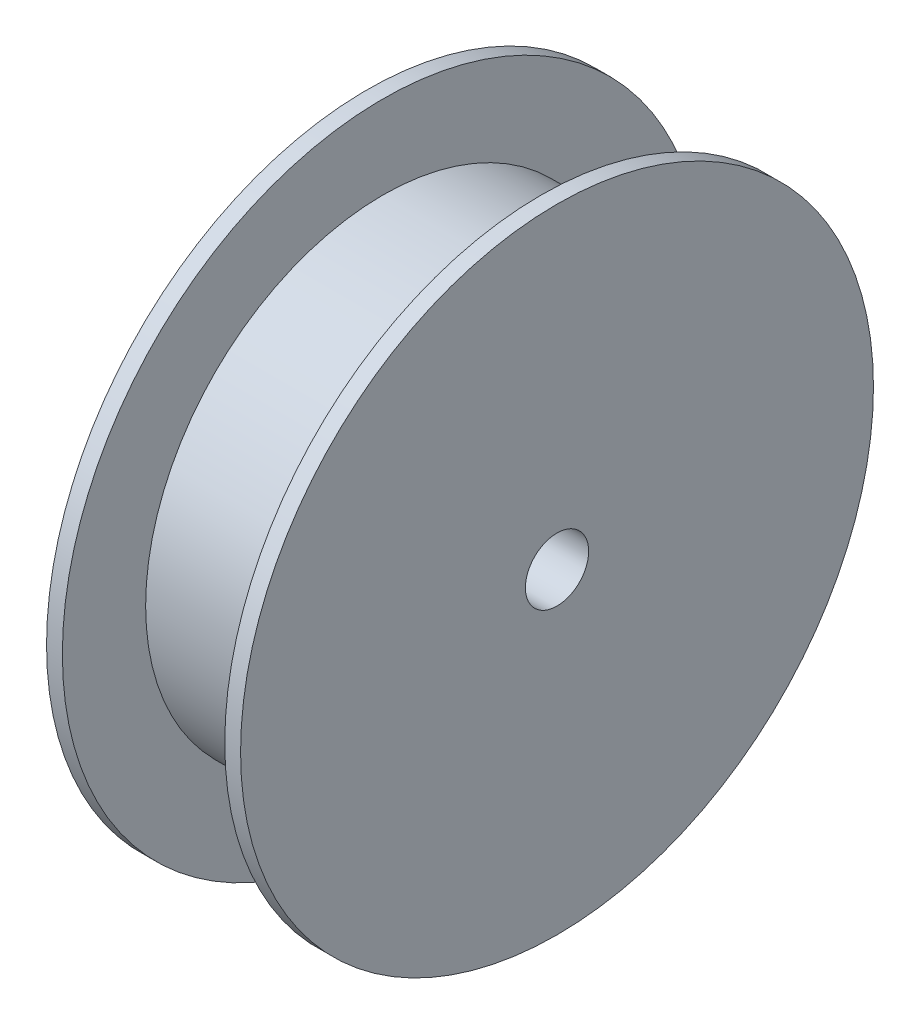
ISO-10303-21;
HEADER;
FILE_DESCRIPTION(('STEP AP214'),'2;1');
FILE_NAME('part.step','',(''),(''),'','','');
FILE_SCHEMA(('AUTOMOTIVE_DESIGN { 1 0 10303 214 1 1 1 1 }'));
ENDSEC;
DATA;
#1=APPLICATION_CONTEXT('core data for automotive mechanical design processes');
#2=APPLICATION_PROTOCOL_DEFINITION('international standard','automotive_design',2000,#1);
#3=PRODUCT_CONTEXT('',#1,'mechanical');
#4=PRODUCT('Part','Part','',(#3));
#5=PRODUCT_RELATED_PRODUCT_CATEGORY('part','',(#4));
#6=PRODUCT_DEFINITION_FORMATION('','',#4);
#7=PRODUCT_DEFINITION_CONTEXT('part definition',#1,'design');
#8=PRODUCT_DEFINITION('design','',#6,#7);
#9=PRODUCT_DEFINITION_SHAPE('','',#8);
#10=(LENGTH_UNIT() NAMED_UNIT(*) SI_UNIT(.MILLI.,.METRE.));
#11=(NAMED_UNIT(*) PLANE_ANGLE_UNIT() SI_UNIT($,.RADIAN.));
#12=(NAMED_UNIT(*) SI_UNIT($,.STERADIAN.) SOLID_ANGLE_UNIT());
#13=UNCERTAINTY_MEASURE_WITH_UNIT(LENGTH_MEASURE(1.E-05),#10,'distance_accuracy_value','');
#14=(GEOMETRIC_REPRESENTATION_CONTEXT(3) GLOBAL_UNCERTAINTY_ASSIGNED_CONTEXT((#13)) GLOBAL_UNIT_ASSIGNED_CONTEXT((#10,
#11,#12)) REPRESENTATION_CONTEXT('',''));
#15=CARTESIAN_POINT('',(0.,0.,0.));
#16=DIRECTION('',(0.,0.,1.));
#17=DIRECTION('',(1.,0.,0.));
#18=AXIS2_PLACEMENT_3D('',#15,#16,#17);
#19=CARTESIAN_POINT('',(-6.5,20.2631578947368,0.));
#20=DIRECTION('',(1.,0.,0.));
#21=DIRECTION('',(0.,0.,-1.));
#22=AXIS2_PLACEMENT_3D('',#19,#20,#21);
#23=PLANE('',#22);
#24=CARTESIAN_POINT('',(-6.5,0.,0.));
#25=DIRECTION('',(1.,0.,0.));
#26=DIRECTION('',(0.,0.,-1.));
#27=AXIS2_PLACEMENT_3D('',#24,#25,#26);
#28=CIRCLE('',#27,2.);
#29=CARTESIAN_POINT('',(-6.5,0.,-2.));
#30=VERTEX_POINT('',#29);
#31=EDGE_CURVE('E56',#30,#30,#28,.T.);
#32=ORIENTED_EDGE('',*,*,#31,.T.);
#33=EDGE_LOOP('',(#32));
#34=FACE_BOUND('',#33,.T.);
#35=CARTESIAN_POINT('',(-6.5,0.,0.));
#36=DIRECTION('',(-1.,0.,0.));
#37=DIRECTION('',(0.,0.,1.));
#38=AXIS2_PLACEMENT_3D('',#35,#36,#37);
#39=CIRCLE('',#38,20.2631578947368);
#40=CARTESIAN_POINT('',(-6.5,0.,20.2631578947368));
#41=VERTEX_POINT('',#40);
#42=EDGE_CURVE('E53',#41,#41,#39,.T.);
#43=ORIENTED_EDGE('',*,*,#42,.T.);
#44=EDGE_LOOP('',(#43));
#45=FACE_BOUND('',#44,.T.);
#46=ADVANCED_FACE('F31',(#34,#45),#23,.F.);
#47=CARTESIAN_POINT('',(5.5,0.,0.));
#48=DIRECTION('',(-1.,0.,0.));
#49=DIRECTION('',(0.,0.,1.));
#50=AXIS2_PLACEMENT_3D('',#47,#48,#49);
#51=PLANE('',#50);
#52=CARTESIAN_POINT('',(5.5,0.,0.));
#53=DIRECTION('',(1.,0.,0.));
#54=DIRECTION('',(0.,0.,-1.));
#55=AXIS2_PLACEMENT_3D('',#52,#53,#54);
#56=CIRCLE('',#55,2.);
#57=CARTESIAN_POINT('',(5.5,0.,-2.));
#58=VERTEX_POINT('',#57);
#59=EDGE_CURVE('E57',#58,#58,#56,.T.);
#60=ORIENTED_EDGE('',*,*,#59,.F.);
#61=EDGE_LOOP('',(#60));
#62=FACE_BOUND('',#61,.T.);
#63=CARTESIAN_POINT('',(5.5,0.,0.));
#64=DIRECTION('',(-1.,0.,0.));
#65=DIRECTION('',(0.,0.,1.));
#66=AXIS2_PLACEMENT_3D('',#63,#64,#65);
#67=CIRCLE('',#66,20.);
#68=CARTESIAN_POINT('',(5.5,0.,20.));
#69=VERTEX_POINT('',#68);
#70=EDGE_CURVE('E10',#69,#69,#67,.T.);
#71=ORIENTED_EDGE('',*,*,#70,.F.);
#72=EDGE_LOOP('',(#71));
#73=FACE_BOUND('',#72,.T.);
#74=ADVANCED_FACE('F72',(#62,#73),#51,.F.);
#75=CARTESIAN_POINT('',(-6.5,0.,0.));
#76=DIRECTION('',(-1.,0.,0.));
#77=DIRECTION('',(0.,0.,1.));
#78=AXIS2_PLACEMENT_3D('',#75,#76,#77);
#79=CYLINDRICAL_SURFACE('',#78,20.);
#80=CARTESIAN_POINT('',(4.5,0.,0.));
#81=DIRECTION('',(-1.,0.,0.));
#82=DIRECTION('',(0.,0.,1.));
#83=AXIS2_PLACEMENT_3D('',#80,#81,#82);
#84=CIRCLE('',#83,20.);
#85=CARTESIAN_POINT('',(4.5,0.,20.));
#86=VERTEX_POINT('',#85);
#87=EDGE_CURVE('E37',#86,#86,#84,.T.);
#88=ORIENTED_EDGE('',*,*,#87,.F.);
#89=EDGE_LOOP('',(#88));
#90=FACE_BOUND('',#89,.T.);
#91=ORIENTED_EDGE('',*,*,#70,.T.);
#92=EDGE_LOOP('',(#91));
#93=FACE_BOUND('',#92,.T.);
#94=ADVANCED_FACE('F75',(#90,#93),#79,.T.);
#95=CARTESIAN_POINT('',(4.5,20.,0.));
#96=DIRECTION('',(1.,0.,0.));
#97=DIRECTION('',(0.,0.,-1.));
#98=AXIS2_PLACEMENT_3D('',#95,#96,#97);
#99=PLANE('',#98);
#100=CARTESIAN_POINT('',(4.5,0.,0.));
#101=DIRECTION('',(-1.,0.,0.));
#102=DIRECTION('',(0.,0.,1.));
#103=AXIS2_PLACEMENT_3D('',#100,#101,#102);
#104=CIRCLE('',#103,15.);
#105=CARTESIAN_POINT('',(4.5,0.,15.));
#106=VERTEX_POINT('',#105);
#107=EDGE_CURVE('E41',#106,#106,#104,.T.);
#108=ORIENTED_EDGE('',*,*,#107,.F.);
#109=EDGE_LOOP('',(#108));
#110=FACE_BOUND('',#109,.T.);
#111=ORIENTED_EDGE('',*,*,#87,.T.);
#112=EDGE_LOOP('',(#111));
#113=FACE_BOUND('',#112,.T.);
#114=ADVANCED_FACE('F80',(#110,#113),#99,.F.);
#115=CARTESIAN_POINT('',(-6.5,0.,0.));
#116=DIRECTION('',(-1.,0.,0.));
#117=DIRECTION('',(0.,0.,1.));
#118=AXIS2_PLACEMENT_3D('',#115,#116,#117);
#119=CYLINDRICAL_SURFACE('',#118,15.);
#120=CARTESIAN_POINT('',(-5.5,0.,0.));
#121=DIRECTION('',(-1.,0.,0.));
#122=DIRECTION('',(0.,0.,1.));
#123=AXIS2_PLACEMENT_3D('',#120,#121,#122);
#124=CIRCLE('',#123,15.);
#125=CARTESIAN_POINT('',(-5.5,0.,15.));
#126=VERTEX_POINT('',#125);
#127=EDGE_CURVE('E45',#126,#126,#124,.T.);
#128=ORIENTED_EDGE('',*,*,#127,.F.);
#129=EDGE_LOOP('',(#128));
#130=FACE_BOUND('',#129,.T.);
#131=ORIENTED_EDGE('',*,*,#107,.T.);
#132=EDGE_LOOP('',(#131));
#133=FACE_BOUND('',#132,.T.);
#134=ADVANCED_FACE('F86',(#130,#133),#119,.T.);
#135=CARTESIAN_POINT('',(-5.5,15.,0.));
#136=DIRECTION('',(-1.,0.,0.));
#137=DIRECTION('',(0.,0.,1.));
#138=AXIS2_PLACEMENT_3D('',#135,#136,#137);
#139=PLANE('',#138);
#140=CARTESIAN_POINT('',(-5.5,0.,0.));
#141=DIRECTION('',(-1.,0.,0.));
#142=DIRECTION('',(0.,0.,1.));
#143=AXIS2_PLACEMENT_3D('',#140,#141,#142);
#144=CIRCLE('',#143,20.2631578947368);
#145=CARTESIAN_POINT('',(-5.5,0.,20.2631578947368));
#146=VERTEX_POINT('',#145);
#147=EDGE_CURVE('E50',#146,#146,#144,.T.);
#148=ORIENTED_EDGE('',*,*,#147,.F.);
#149=EDGE_LOOP('',(#148));
#150=FACE_BOUND('',#149,.T.);
#151=ORIENTED_EDGE('',*,*,#127,.T.);
#152=EDGE_LOOP('',(#151));
#153=FACE_BOUND('',#152,.T.);
#154=ADVANCED_FACE('F90',(#150,#153),#139,.F.);
#155=CARTESIAN_POINT('',(-6.5,0.,0.));
#156=DIRECTION('',(-1.,0.,0.));
#157=DIRECTION('',(0.,0.,1.));
#158=AXIS2_PLACEMENT_3D('',#155,#156,#157);
#159=CYLINDRICAL_SURFACE('',#158,20.2631578947368);
#160=ORIENTED_EDGE('',*,*,#42,.F.);
#161=EDGE_LOOP('',(#160));
#162=FACE_BOUND('',#161,.T.);
#163=ORIENTED_EDGE('',*,*,#147,.T.);
#164=EDGE_LOOP('',(#163));
#165=FACE_BOUND('',#164,.T.);
#166=ADVANCED_FACE('F68',(#162,#165),#159,.T.);
#167=CARTESIAN_POINT('',(-6.5,0.,0.));
#168=DIRECTION('',(1.,0.,0.));
#169=DIRECTION('',(0.,0.,-1.));
#170=AXIS2_PLACEMENT_3D('',#167,#168,#169);
#171=CYLINDRICAL_SURFACE('',#170,2.);
#172=ORIENTED_EDGE('',*,*,#31,.F.);
#173=EDGE_LOOP('',(#172));
#174=FACE_BOUND('',#173,.T.);
#175=ORIENTED_EDGE('',*,*,#59,.T.);
#176=EDGE_LOOP('',(#175));
#177=FACE_BOUND('',#176,.T.);
#178=ADVANCED_FACE('F65',(#174,#177),#171,.F.);
#179=CLOSED_SHELL('',(#46,#74,#94,#114,#134,#154,#166,#178));
#180=MANIFOLD_SOLID_BREP('B2',#179);
#181=ADVANCED_BREP_SHAPE_REPRESENTATION('',(#18,#180),#14);
#182=SHAPE_DEFINITION_REPRESENTATION(#9,#181);
ENDSEC;
END-ISO-10303-21;
